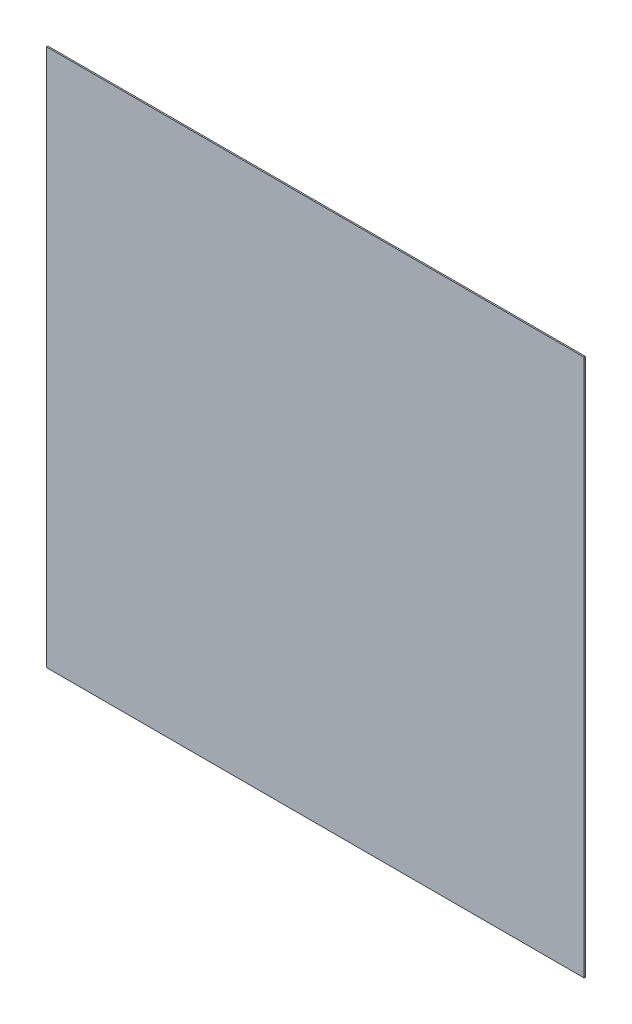
ISO-10303-21;
HEADER;
FILE_DESCRIPTION(('STEP AP214'),'2;1');
FILE_NAME('part.step','',(''),(''),'','','');
FILE_SCHEMA(('AUTOMOTIVE_DESIGN { 1 0 10303 214 1 1 1 1 }'));
ENDSEC;
DATA;
#1=APPLICATION_CONTEXT('core data for automotive mechanical design processes');
#2=APPLICATION_PROTOCOL_DEFINITION('international standard','automotive_design',2000,#1);
#3=PRODUCT_CONTEXT('',#1,'mechanical');
#4=PRODUCT('Part','Part','',(#3));
#5=PRODUCT_RELATED_PRODUCT_CATEGORY('part','',(#4));
#6=PRODUCT_DEFINITION_FORMATION('','',#4);
#7=PRODUCT_DEFINITION_CONTEXT('part definition',#1,'design');
#8=PRODUCT_DEFINITION('design','',#6,#7);
#9=PRODUCT_DEFINITION_SHAPE('','',#8);
#10=(LENGTH_UNIT() NAMED_UNIT(*) SI_UNIT(.MILLI.,.METRE.));
#11=(NAMED_UNIT(*) PLANE_ANGLE_UNIT() SI_UNIT($,.RADIAN.));
#12=(NAMED_UNIT(*) SI_UNIT($,.STERADIAN.) SOLID_ANGLE_UNIT());
#13=UNCERTAINTY_MEASURE_WITH_UNIT(LENGTH_MEASURE(1.E-05),#10,'distance_accuracy_value','');
#14=(GEOMETRIC_REPRESENTATION_CONTEXT(3) GLOBAL_UNCERTAINTY_ASSIGNED_CONTEXT((#13)) GLOBAL_UNIT_ASSIGNED_CONTEXT((#10,
#11,#12)) REPRESENTATION_CONTEXT('',''));
#15=CARTESIAN_POINT('',(0.,0.,0.));
#16=DIRECTION('',(0.,0.,1.));
#17=DIRECTION('',(1.,0.,0.));
#18=AXIS2_PLACEMENT_3D('',#15,#16,#17);
#19=CARTESIAN_POINT('',(0.,0.,0.0862));
#20=DIRECTION('',(0.,0.,-1.));
#21=DIRECTION('',(-1.,0.,0.));
#22=AXIS2_PLACEMENT_3D('',#19,#20,#21);
#23=PLANE('',#22);
#24=DIRECTION('',(1.,0.,0.));
#25=VECTOR('',#24,1.);
#26=CARTESIAN_POINT('',(2.,-2.,0.0862));
#27=LINE('',#26,#25);
#28=CARTESIAN_POINT('',(2.,-2.,0.0862));
#29=VERTEX_POINT('',#28);
#30=CARTESIAN_POINT('',(-2.,-2.,0.0862));
#31=VERTEX_POINT('',#30);
#32=EDGE_CURVE('E53',#29,#31,#27,.F.);
#33=ORIENTED_EDGE('',*,*,#32,.F.);
#34=DIRECTION('',(0.,1.,0.));
#35=VECTOR('',#34,1.);
#36=CARTESIAN_POINT('',(2.,2.,0.0862));
#37=LINE('',#36,#35);
#38=CARTESIAN_POINT('',(2.,2.,0.0862));
#39=VERTEX_POINT('',#38);
#40=EDGE_CURVE('E68',#39,#29,#37,.F.);
#41=ORIENTED_EDGE('',*,*,#40,.F.);
#42=DIRECTION('',(1.,0.,0.));
#43=VECTOR('',#42,1.);
#44=CARTESIAN_POINT('',(-2.,2.,0.0862));
#45=LINE('',#44,#43);
#46=CARTESIAN_POINT('',(-2.,2.,0.0862));
#47=VERTEX_POINT('',#46);
#48=EDGE_CURVE('E20',#47,#39,#45,.T.);
#49=ORIENTED_EDGE('',*,*,#48,.F.);
#50=DIRECTION('',(0.,1.,0.));
#51=VECTOR('',#50,1.);
#52=CARTESIAN_POINT('',(-2.,-2.,0.0862));
#53=LINE('',#52,#51);
#54=EDGE_CURVE('E58',#31,#47,#53,.T.);
#55=ORIENTED_EDGE('',*,*,#54,.F.);
#56=EDGE_LOOP('',(#33,#41,#49,#55));
#57=FACE_BOUND('',#56,.T.);
#58=ADVANCED_FACE('F17',(#57),#23,.F.);
#59=CARTESIAN_POINT('',(-2.,2.,0.0762));
#60=DIRECTION('',(0.,1.,0.));
#61=DIRECTION('',(0.,0.,1.));
#62=AXIS2_PLACEMENT_3D('',#59,#60,#61);
#63=PLANE('',#62);
#64=DIRECTION('',(0.,0.,-1.));
#65=VECTOR('',#64,1.);
#66=CARTESIAN_POINT('',(2.,2.,0.0762));
#67=LINE('',#66,#65);
#68=CARTESIAN_POINT('',(2.,2.,0.076200000000005));
#69=VERTEX_POINT('',#68);
#70=EDGE_CURVE('E79',#69,#39,#67,.F.);
#71=ORIENTED_EDGE('',*,*,#70,.F.);
#72=DIRECTION('',(1.,0.,0.));
#73=VECTOR('',#72,1.);
#74=CARTESIAN_POINT('',(-8.159,2.,0.07620000000002));
#75=LINE('',#74,#73);
#76=CARTESIAN_POINT('',(-2.,2.,0.076200000000005));
#77=VERTEX_POINT('',#76);
#78=EDGE_CURVE('E74',#69,#77,#75,.F.);
#79=ORIENTED_EDGE('',*,*,#78,.T.);
#80=DIRECTION('',(0.,0.,1.));
#81=VECTOR('',#80,1.);
#82=CARTESIAN_POINT('',(-2.,2.,0.0762));
#83=LINE('',#82,#81);
#84=EDGE_CURVE('E63',#47,#77,#83,.F.);
#85=ORIENTED_EDGE('',*,*,#84,.F.);
#86=ORIENTED_EDGE('',*,*,#48,.T.);
#87=EDGE_LOOP('',(#71,#79,#85,#86));
#88=FACE_BOUND('',#87,.T.);
#89=ADVANCED_FACE('F73',(#88),#63,.T.);
#90=CARTESIAN_POINT('',(-2.,-2.,0.0762));
#91=DIRECTION('',(-1.,0.,0.));
#92=DIRECTION('',(0.,0.,1.));
#93=AXIS2_PLACEMENT_3D('',#90,#91,#92);
#94=PLANE('',#93);
#95=ORIENTED_EDGE('',*,*,#84,.T.);
#96=DIRECTION('',(0.,1.,0.));
#97=VECTOR('',#96,1.);
#98=CARTESIAN_POINT('',(-2.,0.0004999999999999,0.07620000000002));
#99=LINE('',#98,#97);
#100=CARTESIAN_POINT('',(-2.,-2.,0.076200000000005));
#101=VERTEX_POINT('',#100);
#102=EDGE_CURVE('E84',#77,#101,#99,.F.);
#103=ORIENTED_EDGE('',*,*,#102,.T.);
#104=DIRECTION('',(0.,0.,-1.));
#105=VECTOR('',#104,1.);
#106=CARTESIAN_POINT('',(-2.,-2.,0.0762));
#107=LINE('',#106,#105);
#108=EDGE_CURVE('E65',#31,#101,#107,.T.);
#109=ORIENTED_EDGE('',*,*,#108,.F.);
#110=ORIENTED_EDGE('',*,*,#54,.T.);
#111=EDGE_LOOP('',(#95,#103,#109,#110));
#112=FACE_BOUND('',#111,.T.);
#113=ADVANCED_FACE('F60',(#112),#94,.T.);
#114=CARTESIAN_POINT('',(2.,-2.,0.0762));
#115=DIRECTION('',(0.,-1.,0.));
#116=DIRECTION('',(0.,0.,-1.));
#117=AXIS2_PLACEMENT_3D('',#114,#115,#116);
#118=PLANE('',#117);
#119=ORIENTED_EDGE('',*,*,#108,.T.);
#120=DIRECTION('',(1.,0.,0.));
#121=VECTOR('',#120,1.);
#122=CARTESIAN_POINT('',(-8.159,-2.,0.07620000000002));
#123=LINE('',#122,#121);
#124=CARTESIAN_POINT('',(2.,-2.,0.076200000000005));
#125=VERTEX_POINT('',#124);
#126=EDGE_CURVE('E26',#101,#125,#123,.T.);
#127=ORIENTED_EDGE('',*,*,#126,.T.);
#128=DIRECTION('',(0.,0.,-1.));
#129=VECTOR('',#128,1.);
#130=CARTESIAN_POINT('',(2.,-2.,0.0762));
#131=LINE('',#130,#129);
#132=EDGE_CURVE('E34',#29,#125,#131,.T.);
#133=ORIENTED_EDGE('',*,*,#132,.F.);
#134=ORIENTED_EDGE('',*,*,#32,.T.);
#135=EDGE_LOOP('',(#119,#127,#133,#134));
#136=FACE_BOUND('',#135,.T.);
#137=ADVANCED_FACE('F88',(#136),#118,.T.);
#138=CARTESIAN_POINT('',(2.,2.,0.0762));
#139=DIRECTION('',(1.,0.,0.));
#140=DIRECTION('',(0.,0.,-1.));
#141=AXIS2_PLACEMENT_3D('',#138,#139,#140);
#142=PLANE('',#141);
#143=ORIENTED_EDGE('',*,*,#132,.T.);
#144=DIRECTION('',(0.,1.,0.));
#145=VECTOR('',#144,1.);
#146=CARTESIAN_POINT('',(2.,0.0004999999999999,0.07620000000002));
#147=LINE('',#146,#145);
#148=EDGE_CURVE('E11',#125,#69,#147,.T.);
#149=ORIENTED_EDGE('',*,*,#148,.T.);
#150=ORIENTED_EDGE('',*,*,#70,.T.);
#151=ORIENTED_EDGE('',*,*,#40,.T.);
#152=EDGE_LOOP('',(#143,#149,#150,#151));
#153=FACE_BOUND('',#152,.T.);
#154=ADVANCED_FACE('F91',(#153),#142,.T.);
#155=CARTESIAN_POINT('',(-8.159,0.0004999999999999,0.07620000000002));
#156=DIRECTION('',(0.,0.,1.));
#157=DIRECTION('',(1.,0.,0.));
#158=AXIS2_PLACEMENT_3D('',#155,#156,#157);
#159=PLANE('',#158);
#160=ORIENTED_EDGE('',*,*,#126,.F.);
#161=ORIENTED_EDGE('',*,*,#102,.F.);
#162=ORIENTED_EDGE('',*,*,#78,.F.);
#163=ORIENTED_EDGE('',*,*,#148,.F.);
#164=EDGE_LOOP('',(#160,#161,#162,#163));
#165=FACE_BOUND('',#164,.T.);
#166=ADVANCED_FACE('F90',(#165),#159,.F.);
#167=CLOSED_SHELL('',(#58,#89,#113,#137,#154,#166));
#168=MANIFOLD_SOLID_BREP('B1',#167);
#169=ADVANCED_BREP_SHAPE_REPRESENTATION('',(#18,#168),#14);
#170=SHAPE_DEFINITION_REPRESENTATION(#9,#169);
ENDSEC;
END-ISO-10303-21;
